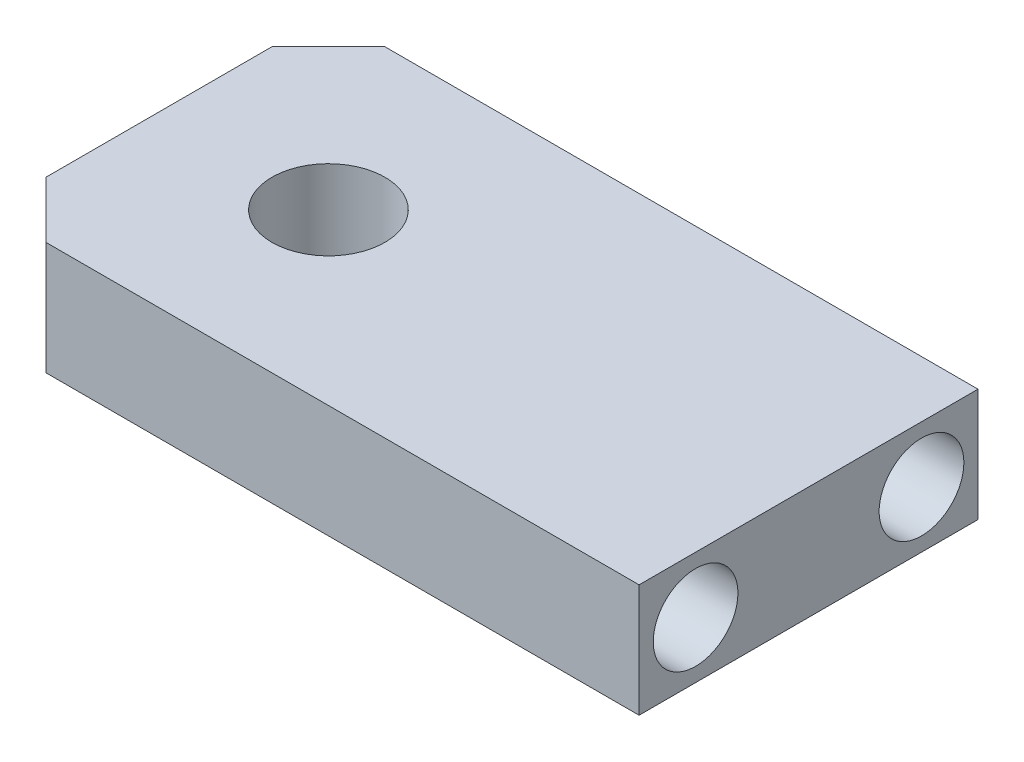
ISO-10303-21;
HEADER;
FILE_DESCRIPTION(('STEP AP214'),'2;1');
FILE_NAME('part.step','',(''),(''),'','','');
FILE_SCHEMA(('AUTOMOTIVE_DESIGN { 1 0 10303 214 1 1 1 1 }'));
ENDSEC;
DATA;
#1=APPLICATION_CONTEXT('core data for automotive mechanical design processes');
#2=APPLICATION_PROTOCOL_DEFINITION('international standard','automotive_design',2000,#1);
#3=PRODUCT_CONTEXT('',#1,'mechanical');
#4=PRODUCT('Part','Part','',(#3));
#5=PRODUCT_RELATED_PRODUCT_CATEGORY('part','',(#4));
#6=PRODUCT_DEFINITION_FORMATION('','',#4);
#7=PRODUCT_DEFINITION_CONTEXT('part definition',#1,'design');
#8=PRODUCT_DEFINITION('design','',#6,#7);
#9=PRODUCT_DEFINITION_SHAPE('','',#8);
#10=(LENGTH_UNIT() NAMED_UNIT(*) SI_UNIT(.MILLI.,.METRE.));
#11=(NAMED_UNIT(*) PLANE_ANGLE_UNIT() SI_UNIT($,.RADIAN.));
#12=(NAMED_UNIT(*) SI_UNIT($,.STERADIAN.) SOLID_ANGLE_UNIT());
#13=UNCERTAINTY_MEASURE_WITH_UNIT(LENGTH_MEASURE(1.E-05),#10,'distance_accuracy_value','');
#14=(GEOMETRIC_REPRESENTATION_CONTEXT(3) GLOBAL_UNCERTAINTY_ASSIGNED_CONTEXT((#13)) GLOBAL_UNIT_ASSIGNED_CONTEXT((#10,
#11,#12)) REPRESENTATION_CONTEXT('',''));
#15=CARTESIAN_POINT('',(0.,0.,0.));
#16=DIRECTION('',(0.,0.,1.));
#17=DIRECTION('',(1.,0.,0.));
#18=AXIS2_PLACEMENT_3D('',#15,#16,#17);
#19=CARTESIAN_POINT('',(11.5,4.,-6.));
#20=DIRECTION('',(-1.,0.,0.));
#21=DIRECTION('',(0.,0.,1.));
#22=AXIS2_PLACEMENT_3D('',#19,#20,#21);
#23=PLANE('',#22);
#24=CARTESIAN_POINT('',(11.5,2.,4.));
#25=DIRECTION('',(1.,0.,0.));
#26=DIRECTION('',(0.,0.,-1.));
#27=AXIS2_PLACEMENT_3D('',#24,#25,#26);
#28=CIRCLE('',#27,1.5);
#29=CARTESIAN_POINT('',(11.5,2.,2.5));
#30=VERTEX_POINT('',#29);
#31=EDGE_CURVE('E159',#30,#30,#28,.T.);
#32=ORIENTED_EDGE('',*,*,#31,.F.);
#33=EDGE_LOOP('',(#32));
#34=FACE_BOUND('',#33,.T.);
#35=CARTESIAN_POINT('',(11.5,2.,-4.));
#36=DIRECTION('',(1.,0.,0.));
#37=DIRECTION('',(0.,0.,-1.));
#38=AXIS2_PLACEMENT_3D('',#35,#36,#37);
#39=CIRCLE('',#38,1.5);
#40=CARTESIAN_POINT('',(11.5,2.,-5.5));
#41=VERTEX_POINT('',#40);
#42=EDGE_CURVE('E152',#41,#41,#39,.T.);
#43=ORIENTED_EDGE('',*,*,#42,.F.);
#44=EDGE_LOOP('',(#43));
#45=FACE_BOUND('',#44,.T.);
#46=DIRECTION('',(0.,0.,-1.));
#47=VECTOR('',#46,1.);
#48=CARTESIAN_POINT('',(11.5,0.,-6.));
#49=LINE('',#48,#47);
#50=CARTESIAN_POINT('',(11.5,0.,6.));
#51=VERTEX_POINT('',#50);
#52=CARTESIAN_POINT('',(11.5,0.,-6.));
#53=VERTEX_POINT('',#52);
#54=EDGE_CURVE('E113',#51,#53,#49,.T.);
#55=ORIENTED_EDGE('',*,*,#54,.T.);
#56=DIRECTION('',(0.,-1.,0.));
#57=VECTOR('',#56,1.);
#58=CARTESIAN_POINT('',(11.5,4.,-6.));
#59=LINE('',#58,#57);
#60=CARTESIAN_POINT('',(11.5,4.,-6.));
#61=VERTEX_POINT('',#60);
#62=EDGE_CURVE('E96',#61,#53,#59,.T.);
#63=ORIENTED_EDGE('',*,*,#62,.F.);
#64=DIRECTION('',(0.,0.,-1.));
#65=VECTOR('',#64,1.);
#66=CARTESIAN_POINT('',(11.5,4.,-6.));
#67=LINE('',#66,#65);
#68=CARTESIAN_POINT('',(11.5,4.,6.));
#69=VERTEX_POINT('',#68);
#70=EDGE_CURVE('E101',#69,#61,#67,.T.);
#71=ORIENTED_EDGE('',*,*,#70,.F.);
#72=DIRECTION('',(0.,-1.,0.));
#73=VECTOR('',#72,1.);
#74=CARTESIAN_POINT('',(11.5,4.,6.));
#75=LINE('',#74,#73);
#76=EDGE_CURVE('E115',#69,#51,#75,.T.);
#77=ORIENTED_EDGE('',*,*,#76,.T.);
#78=EDGE_LOOP('',(#55,#63,#71,#77));
#79=FACE_BOUND('',#78,.T.);
#80=ADVANCED_FACE('F39',(#34,#45,#79),#23,.F.);
#81=CARTESIAN_POINT('',(-11.5,4.,-6.));
#82=DIRECTION('',(0.,0.,1.));
#83=DIRECTION('',(1.,0.,0.));
#84=AXIS2_PLACEMENT_3D('',#81,#82,#83);
#85=PLANE('',#84);
#86=DIRECTION('',(-1.,0.,0.));
#87=VECTOR('',#86,1.);
#88=CARTESIAN_POINT('',(-11.5,0.,-6.));
#89=LINE('',#88,#87);
#90=CARTESIAN_POINT('',(-9.49999999999999,0.,-6.));
#91=VERTEX_POINT('',#90);
#92=EDGE_CURVE('E145',#53,#91,#89,.T.);
#93=ORIENTED_EDGE('',*,*,#92,.T.);
#94=DIRECTION('',(0.,1.,0.));
#95=VECTOR('',#94,1.);
#96=CARTESIAN_POINT('',(-9.49999999999999,4.,-6.));
#97=LINE('',#96,#95);
#98=CARTESIAN_POINT('',(-9.49999999999999,4.,-6.));
#99=VERTEX_POINT('',#98);
#100=EDGE_CURVE('E11',#91,#99,#97,.T.);
#101=ORIENTED_EDGE('',*,*,#100,.T.);
#102=DIRECTION('',(-1.,0.,0.));
#103=VECTOR('',#102,1.);
#104=CARTESIAN_POINT('',(-11.5,4.,-6.));
#105=LINE('',#104,#103);
#106=EDGE_CURVE('E92',#61,#99,#105,.T.);
#107=ORIENTED_EDGE('',*,*,#106,.F.);
#108=ORIENTED_EDGE('',*,*,#62,.T.);
#109=EDGE_LOOP('',(#93,#101,#107,#108));
#110=FACE_BOUND('',#109,.T.);
#111=ADVANCED_FACE('F94',(#110),#85,.F.);
#112=CARTESIAN_POINT('',(-11.5,4.,-6.));
#113=DIRECTION('',(1.,0.,0.));
#114=DIRECTION('',(0.,0.,-1.));
#115=AXIS2_PLACEMENT_3D('',#112,#113,#114);
#116=PLANE('',#115);
#117=DIRECTION('',(0.,0.,1.));
#118=VECTOR('',#117,1.);
#119=CARTESIAN_POINT('',(-11.5,0.,-6.));
#120=LINE('',#119,#118);
#121=CARTESIAN_POINT('',(-11.5,0.,-4.));
#122=VERTEX_POINT('',#121);
#123=CARTESIAN_POINT('',(-11.5,0.,4.));
#124=VERTEX_POINT('',#123);
#125=EDGE_CURVE('E142',#122,#124,#120,.T.);
#126=ORIENTED_EDGE('',*,*,#125,.T.);
#127=DIRECTION('',(0.,1.,0.));
#128=VECTOR('',#127,1.);
#129=CARTESIAN_POINT('',(-11.5,4.,4.));
#130=LINE('',#129,#128);
#131=CARTESIAN_POINT('',(-11.5,4.,4.));
#132=VERTEX_POINT('',#131);
#133=EDGE_CURVE('E61',#124,#132,#130,.T.);
#134=ORIENTED_EDGE('',*,*,#133,.T.);
#135=DIRECTION('',(0.,0.,1.));
#136=VECTOR('',#135,1.);
#137=CARTESIAN_POINT('',(-11.5,4.,-6.));
#138=LINE('',#137,#136);
#139=CARTESIAN_POINT('',(-11.5,4.,-4.));
#140=VERTEX_POINT('',#139);
#141=EDGE_CURVE('E100',#140,#132,#138,.T.);
#142=ORIENTED_EDGE('',*,*,#141,.F.);
#143=DIRECTION('',(0.,-1.,0.));
#144=VECTOR('',#143,1.);
#145=CARTESIAN_POINT('',(-11.5,4.,-4.));
#146=LINE('',#145,#144);
#147=EDGE_CURVE('E126',#140,#122,#146,.T.);
#148=ORIENTED_EDGE('',*,*,#147,.T.);
#149=EDGE_LOOP('',(#126,#134,#142,#148));
#150=FACE_BOUND('',#149,.T.);
#151=ADVANCED_FACE('F143',(#150),#116,.F.);
#152=CARTESIAN_POINT('',(-11.5,4.,6.));
#153=DIRECTION('',(0.,0.,-1.));
#154=DIRECTION('',(-1.,0.,0.));
#155=AXIS2_PLACEMENT_3D('',#152,#153,#154);
#156=PLANE('',#155);
#157=DIRECTION('',(1.,0.,0.));
#158=VECTOR('',#157,1.);
#159=CARTESIAN_POINT('',(-11.5,4.,6.));
#160=LINE('',#159,#158);
#161=CARTESIAN_POINT('',(-9.50000000000001,4.,6.));
#162=VERTEX_POINT('',#161);
#163=EDGE_CURVE('E106',#162,#69,#160,.T.);
#164=ORIENTED_EDGE('',*,*,#163,.F.);
#165=DIRECTION('',(0.,-1.,0.));
#166=VECTOR('',#165,1.);
#167=CARTESIAN_POINT('',(-9.50000000000001,4.,6.));
#168=LINE('',#167,#166);
#169=CARTESIAN_POINT('',(-9.50000000000001,0.,6.));
#170=VERTEX_POINT('',#169);
#171=EDGE_CURVE('E114',#162,#170,#168,.T.);
#172=ORIENTED_EDGE('',*,*,#171,.T.);
#173=DIRECTION('',(1.,0.,0.));
#174=VECTOR('',#173,1.);
#175=CARTESIAN_POINT('',(-11.5,0.,6.));
#176=LINE('',#175,#174);
#177=EDGE_CURVE('E110',#170,#51,#176,.T.);
#178=ORIENTED_EDGE('',*,*,#177,.T.);
#179=ORIENTED_EDGE('',*,*,#76,.F.);
#180=EDGE_LOOP('',(#164,#172,#178,#179));
#181=FACE_BOUND('',#180,.T.);
#182=ADVANCED_FACE('F135',(#181),#156,.F.);
#183=CARTESIAN_POINT('',(0.,4.,0.));
#184=DIRECTION('',(0.,1.,0.));
#185=DIRECTION('',(0.,0.,1.));
#186=AXIS2_PLACEMENT_3D('',#183,#184,#185);
#187=PLANE('',#186);
#188=CARTESIAN_POINT('',(-5.5,4.,0.));
#189=DIRECTION('',(0.,1.,0.));
#190=DIRECTION('',(0.,0.,1.));
#191=AXIS2_PLACEMENT_3D('',#188,#189,#190);
#192=CIRCLE('',#191,2.);
#193=CARTESIAN_POINT('',(-5.5,4.,2.));
#194=VERTEX_POINT('',#193);
#195=EDGE_CURVE('E164',#194,#194,#192,.T.);
#196=ORIENTED_EDGE('',*,*,#195,.F.);
#197=EDGE_LOOP('',(#196));
#198=FACE_BOUND('',#197,.T.);
#199=ORIENTED_EDGE('',*,*,#141,.T.);
#200=DIRECTION('',(-0.707106781186546,0.,-0.707106781186549));
#201=VECTOR('',#200,1.);
#202=CARTESIAN_POINT('',(-7.75000000000002,4.,7.75));
#203=LINE('',#202,#201);
#204=EDGE_CURVE('E48',#132,#162,#203,.F.);
#205=ORIENTED_EDGE('',*,*,#204,.T.);
#206=ORIENTED_EDGE('',*,*,#163,.T.);
#207=ORIENTED_EDGE('',*,*,#70,.T.);
#208=ORIENTED_EDGE('',*,*,#106,.T.);
#209=DIRECTION('',(0.707106781186549,0.,-0.707106781186546));
#210=VECTOR('',#209,1.);
#211=CARTESIAN_POINT('',(-7.74999999999997,4.,-7.75000000000001));
#212=LINE('',#211,#210);
#213=EDGE_CURVE('E130',#99,#140,#212,.F.);
#214=ORIENTED_EDGE('',*,*,#213,.T.);
#215=EDGE_LOOP('',(#199,#205,#206,#207,#208,#214));
#216=FACE_BOUND('',#215,.T.);
#217=ADVANCED_FACE('F104',(#198,#216),#187,.T.);
#218=CARTESIAN_POINT('',(0.,0.,0.));
#219=DIRECTION('',(0.,1.,0.));
#220=DIRECTION('',(0.,0.,1.));
#221=AXIS2_PLACEMENT_3D('',#218,#219,#220);
#222=PLANE('',#221);
#223=CARTESIAN_POINT('',(-5.5,0.,0.));
#224=DIRECTION('',(0.,1.,0.));
#225=DIRECTION('',(0.,0.,1.));
#226=AXIS2_PLACEMENT_3D('',#223,#224,#225);
#227=CIRCLE('',#226,2.);
#228=CARTESIAN_POINT('',(-5.5,0.,2.));
#229=VERTEX_POINT('',#228);
#230=EDGE_CURVE('E156',#229,#229,#227,.T.);
#231=ORIENTED_EDGE('',*,*,#230,.T.);
#232=EDGE_LOOP('',(#231));
#233=FACE_BOUND('',#232,.T.);
#234=ORIENTED_EDGE('',*,*,#177,.F.);
#235=DIRECTION('',(0.707106781186546,0.,0.707106781186549));
#236=VECTOR('',#235,1.);
#237=CARTESIAN_POINT('',(-9.50000000000001,0.,6.));
#238=LINE('',#237,#236);
#239=EDGE_CURVE('E124',#170,#124,#238,.F.);
#240=ORIENTED_EDGE('',*,*,#239,.T.);
#241=ORIENTED_EDGE('',*,*,#125,.F.);
#242=DIRECTION('',(-0.707106781186549,0.,0.707106781186546));
#243=VECTOR('',#242,1.);
#244=CARTESIAN_POINT('',(-11.5,0.,-4.));
#245=LINE('',#244,#243);
#246=EDGE_CURVE('E118',#122,#91,#245,.F.);
#247=ORIENTED_EDGE('',*,*,#246,.T.);
#248=ORIENTED_EDGE('',*,*,#92,.F.);
#249=ORIENTED_EDGE('',*,*,#54,.F.);
#250=EDGE_LOOP('',(#234,#240,#241,#247,#248,#249));
#251=FACE_BOUND('',#250,.T.);
#252=ADVANCED_FACE('F141',(#233,#251),#222,.F.);
#253=CARTESIAN_POINT('',(1.5,2.,-4.));
#254=DIRECTION('',(1.,0.,0.));
#255=DIRECTION('',(0.,0.,-1.));
#256=AXIS2_PLACEMENT_3D('',#253,#254,#255);
#257=CYLINDRICAL_SURFACE('',#256,1.5);
#258=CARTESIAN_POINT('',(1.5,2.,-4.));
#259=DIRECTION('',(1.,0.,0.));
#260=DIRECTION('',(0.,0.,-1.));
#261=AXIS2_PLACEMENT_3D('',#258,#259,#260);
#262=CIRCLE('',#261,1.5);
#263=CARTESIAN_POINT('',(1.50000000000001,2.,-5.5));
#264=VERTEX_POINT('',#263);
#265=EDGE_CURVE('E155',#264,#264,#262,.T.);
#266=ORIENTED_EDGE('',*,*,#265,.F.);
#267=EDGE_LOOP('',(#266));
#268=FACE_BOUND('',#267,.T.);
#269=ORIENTED_EDGE('',*,*,#42,.T.);
#270=EDGE_LOOP('',(#269));
#271=FACE_BOUND('',#270,.T.);
#272=ADVANCED_FACE('F184',(#268,#271),#257,.F.);
#273=CARTESIAN_POINT('',(1.5,2.,-4.));
#274=DIRECTION('',(1.,0.,0.));
#275=DIRECTION('',(0.,0.,-1.));
#276=AXIS2_PLACEMENT_3D('',#273,#274,#275);
#277=PLANE('',#276);
#278=ORIENTED_EDGE('',*,*,#265,.T.);
#279=EDGE_LOOP('',(#278));
#280=FACE_BOUND('',#279,.T.);
#281=ADVANCED_FACE('F269',(#280),#277,.T.);
#282=CARTESIAN_POINT('',(1.5,2.,4.));
#283=DIRECTION('',(1.,0.,0.));
#284=DIRECTION('',(0.,0.,-1.));
#285=AXIS2_PLACEMENT_3D('',#282,#283,#284);
#286=CYLINDRICAL_SURFACE('',#285,1.5);
#287=CARTESIAN_POINT('',(1.5,2.,4.));
#288=DIRECTION('',(1.,0.,0.));
#289=DIRECTION('',(0.,0.,-1.));
#290=AXIS2_PLACEMENT_3D('',#287,#288,#289);
#291=CIRCLE('',#290,1.5);
#292=CARTESIAN_POINT('',(1.50000000000001,2.,2.5));
#293=VERTEX_POINT('',#292);
#294=EDGE_CURVE('E149',#293,#293,#291,.T.);
#295=ORIENTED_EDGE('',*,*,#294,.F.);
#296=EDGE_LOOP('',(#295));
#297=FACE_BOUND('',#296,.T.);
#298=ORIENTED_EDGE('',*,*,#31,.T.);
#299=EDGE_LOOP('',(#298));
#300=FACE_BOUND('',#299,.T.);
#301=ADVANCED_FACE('F259',(#297,#300),#286,.F.);
#302=CARTESIAN_POINT('',(1.5,2.,4.));
#303=DIRECTION('',(1.,0.,0.));
#304=DIRECTION('',(0.,0.,-1.));
#305=AXIS2_PLACEMENT_3D('',#302,#303,#304);
#306=PLANE('',#305);
#307=ORIENTED_EDGE('',*,*,#294,.T.);
#308=EDGE_LOOP('',(#307));
#309=FACE_BOUND('',#308,.T.);
#310=ADVANCED_FACE('F174',(#309),#306,.T.);
#311=CARTESIAN_POINT('',(-5.5,0.,0.));
#312=DIRECTION('',(0.,1.,0.));
#313=DIRECTION('',(0.,0.,1.));
#314=AXIS2_PLACEMENT_3D('',#311,#312,#313);
#315=CYLINDRICAL_SURFACE('',#314,2.);
#316=ORIENTED_EDGE('',*,*,#230,.F.);
#317=EDGE_LOOP('',(#316));
#318=FACE_BOUND('',#317,.T.);
#319=ORIENTED_EDGE('',*,*,#195,.T.);
#320=EDGE_LOOP('',(#319));
#321=FACE_BOUND('',#320,.T.);
#322=ADVANCED_FACE('F171',(#318,#321),#315,.F.);
#323=CARTESIAN_POINT('',(-9.50000000000001,4.,6.));
#324=DIRECTION('',(0.707106781186549,0.,-0.707106781186546));
#325=DIRECTION('',(0.,-1.,0.));
#326=AXIS2_PLACEMENT_3D('',#323,#324,#325);
#327=PLANE('',#326);
#328=ORIENTED_EDGE('',*,*,#204,.F.);
#329=ORIENTED_EDGE('',*,*,#133,.F.);
#330=ORIENTED_EDGE('',*,*,#239,.F.);
#331=ORIENTED_EDGE('',*,*,#171,.F.);
#332=EDGE_LOOP('',(#328,#329,#330,#331));
#333=FACE_BOUND('',#332,.T.);
#334=ADVANCED_FACE('F138',(#333),#327,.F.);
#335=CARTESIAN_POINT('',(-11.5,4.,-4.));
#336=DIRECTION('',(0.707106781186546,0.,0.707106781186549));
#337=DIRECTION('',(0.,-1.,0.));
#338=AXIS2_PLACEMENT_3D('',#335,#336,#337);
#339=PLANE('',#338);
#340=ORIENTED_EDGE('',*,*,#213,.F.);
#341=ORIENTED_EDGE('',*,*,#100,.F.);
#342=ORIENTED_EDGE('',*,*,#246,.F.);
#343=ORIENTED_EDGE('',*,*,#147,.F.);
#344=EDGE_LOOP('',(#340,#341,#342,#343));
#345=FACE_BOUND('',#344,.T.);
#346=ADVANCED_FACE('F42',(#345),#339,.F.);
#347=CLOSED_SHELL('',(#80,#111,#151,#182,#217,#252,#272,#281,#301,#310,#322,#334,#346));
#348=MANIFOLD_SOLID_BREP('B2',#347);
#349=ADVANCED_BREP_SHAPE_REPRESENTATION('',(#18,#348),#14);
#350=SHAPE_DEFINITION_REPRESENTATION(#9,#349);
ENDSEC;
END-ISO-10303-21;
